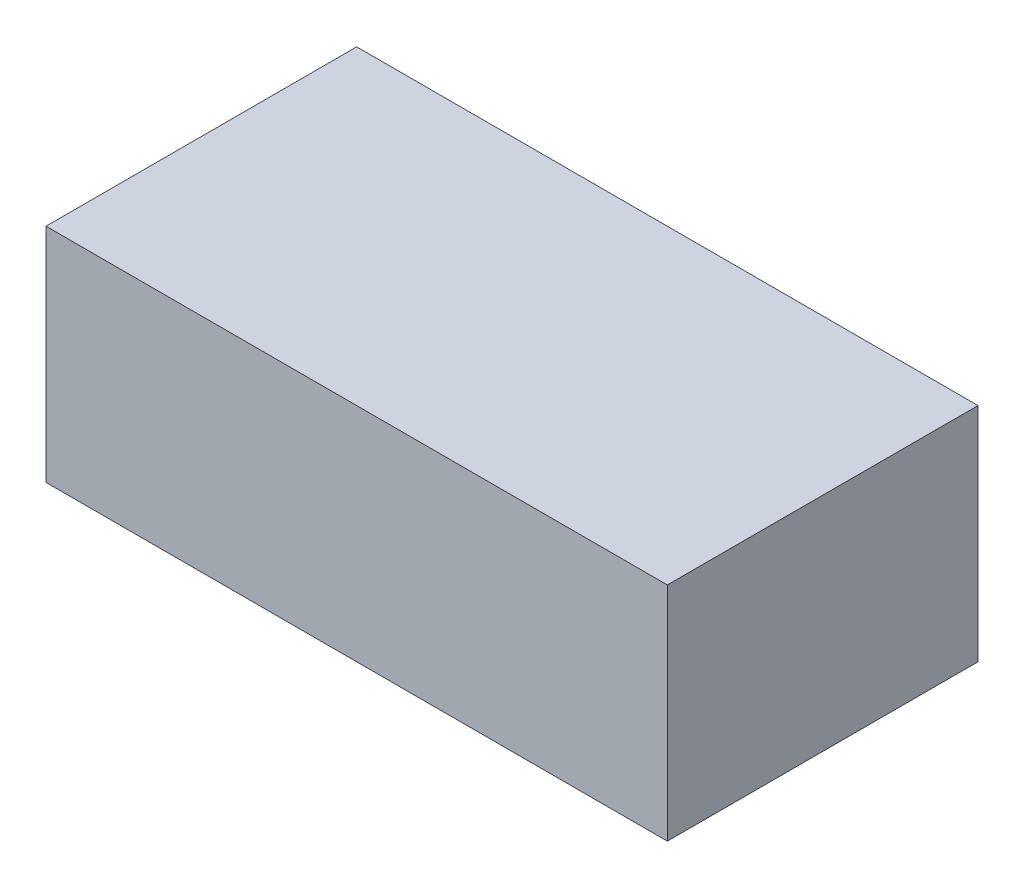
ISO-10303-21;
HEADER;
FILE_DESCRIPTION(('STEP AP214'),'2;1');
FILE_NAME('part.step','',(''),(''),'','','');
FILE_SCHEMA(('AUTOMOTIVE_DESIGN { 1 0 10303 214 1 1 1 1 }'));
ENDSEC;
DATA;
#1=APPLICATION_CONTEXT('core data for automotive mechanical design processes');
#2=APPLICATION_PROTOCOL_DEFINITION('international standard','automotive_design',2000,#1);
#3=PRODUCT_CONTEXT('',#1,'mechanical');
#4=PRODUCT('Part','Part','',(#3));
#5=PRODUCT_RELATED_PRODUCT_CATEGORY('part','',(#4));
#6=PRODUCT_DEFINITION_FORMATION('','',#4);
#7=PRODUCT_DEFINITION_CONTEXT('part definition',#1,'design');
#8=PRODUCT_DEFINITION('design','',#6,#7);
#9=PRODUCT_DEFINITION_SHAPE('','',#8);
#10=(LENGTH_UNIT() NAMED_UNIT(*) SI_UNIT(.MILLI.,.METRE.));
#11=(NAMED_UNIT(*) PLANE_ANGLE_UNIT() SI_UNIT($,.RADIAN.));
#12=(NAMED_UNIT(*) SI_UNIT($,.STERADIAN.) SOLID_ANGLE_UNIT());
#13=UNCERTAINTY_MEASURE_WITH_UNIT(LENGTH_MEASURE(1.E-05),#10,'distance_accuracy_value','');
#14=(GEOMETRIC_REPRESENTATION_CONTEXT(3) GLOBAL_UNCERTAINTY_ASSIGNED_CONTEXT((#13)) GLOBAL_UNIT_ASSIGNED_CONTEXT((#10,
#11,#12)) REPRESENTATION_CONTEXT('',''));
#15=CARTESIAN_POINT('',(0.,0.,0.));
#16=DIRECTION('',(0.,0.,1.));
#17=DIRECTION('',(1.,0.,0.));
#18=AXIS2_PLACEMENT_3D('',#15,#16,#17);
#19=CARTESIAN_POINT('',(0.,0.,0.));
#20=DIRECTION('',(0.,-1.,0.));
#21=DIRECTION('',(0.,0.,-1.));
#22=AXIS2_PLACEMENT_3D('',#19,#20,#21);
#23=PLANE('',#22);
#24=DIRECTION('',(0.,0.,-1.));
#25=VECTOR('',#24,1.);
#26=CARTESIAN_POINT('',(70.,0.,35.));
#27=LINE('',#26,#25);
#28=CARTESIAN_POINT('',(70.,0.,35.));
#29=VERTEX_POINT('',#28);
#30=CARTESIAN_POINT('',(70.,0.,-35.));
#31=VERTEX_POINT('',#30);
#32=EDGE_CURVE('E130',#29,#31,#27,.T.);
#33=ORIENTED_EDGE('',*,*,#32,.F.);
#34=DIRECTION('',(1.,0.,0.));
#35=VECTOR('',#34,1.);
#36=CARTESIAN_POINT('',(-70.,0.,35.));
#37=LINE('',#36,#35);
#38=CARTESIAN_POINT('',(-70.,0.,35.));
#39=VERTEX_POINT('',#38);
#40=EDGE_CURVE('E78',#39,#29,#37,.T.);
#41=ORIENTED_EDGE('',*,*,#40,.F.);
#42=DIRECTION('',(0.,0.,1.));
#43=VECTOR('',#42,1.);
#44=CARTESIAN_POINT('',(-70.,0.,35.));
#45=LINE('',#44,#43);
#46=CARTESIAN_POINT('',(-70.,0.,-35.));
#47=VERTEX_POINT('',#46);
#48=EDGE_CURVE('E158',#47,#39,#45,.T.);
#49=ORIENTED_EDGE('',*,*,#48,.F.);
#50=DIRECTION('',(-1.,0.,0.));
#51=VECTOR('',#50,1.);
#52=CARTESIAN_POINT('',(-70.,0.,-35.));
#53=LINE('',#52,#51);
#54=EDGE_CURVE('E134',#31,#47,#53,.T.);
#55=ORIENTED_EDGE('',*,*,#54,.F.);
#56=EDGE_LOOP('',(#33,#41,#49,#55));
#57=FACE_BOUND('',#56,.T.);
#58=DIRECTION('',(1.,0.,0.));
#59=VECTOR('',#58,1.);
#60=CARTESIAN_POINT('',(0.,0.,33.));
#61=LINE('',#60,#59);
#62=CARTESIAN_POINT('',(-68.,0.,33.));
#63=VERTEX_POINT('',#62);
#64=CARTESIAN_POINT('',(68.,0.,33.));
#65=VERTEX_POINT('',#64);
#66=EDGE_CURVE('E125',#63,#65,#61,.T.);
#67=ORIENTED_EDGE('',*,*,#66,.T.);
#68=DIRECTION('',(0.,0.,-1.));
#69=VECTOR('',#68,1.);
#70=CARTESIAN_POINT('',(68.,0.,0.));
#71=LINE('',#70,#69);
#72=CARTESIAN_POINT('',(68.,0.,-33.));
#73=VERTEX_POINT('',#72);
#74=EDGE_CURVE('E144',#65,#73,#71,.T.);
#75=ORIENTED_EDGE('',*,*,#74,.T.);
#76=DIRECTION('',(-1.,0.,0.));
#77=VECTOR('',#76,1.);
#78=CARTESIAN_POINT('',(0.,0.,-33.));
#79=LINE('',#78,#77);
#80=CARTESIAN_POINT('',(-68.,0.,-33.));
#81=VERTEX_POINT('',#80);
#82=EDGE_CURVE('E129',#73,#81,#79,.T.);
#83=ORIENTED_EDGE('',*,*,#82,.T.);
#84=DIRECTION('',(0.,0.,1.));
#85=VECTOR('',#84,1.);
#86=CARTESIAN_POINT('',(-68.,0.,0.));
#87=LINE('',#86,#85);
#88=EDGE_CURVE('E48',#81,#63,#87,.T.);
#89=ORIENTED_EDGE('',*,*,#88,.T.);
#90=EDGE_LOOP('',(#67,#75,#83,#89));
#91=FACE_BOUND('',#90,.T.);
#92=ADVANCED_FACE('F33',(#57,#91),#23,.T.);
#93=CARTESIAN_POINT('',(70.,50.,35.));
#94=DIRECTION('',(-1.,0.,0.));
#95=DIRECTION('',(0.,0.,1.));
#96=AXIS2_PLACEMENT_3D('',#93,#94,#95);
#97=PLANE('',#96);
#98=ORIENTED_EDGE('',*,*,#32,.T.);
#99=DIRECTION('',(0.,-1.,0.));
#100=VECTOR('',#99,1.);
#101=CARTESIAN_POINT('',(70.,50.,-35.));
#102=LINE('',#101,#100);
#103=CARTESIAN_POINT('',(70.,50.,-35.));
#104=VERTEX_POINT('',#103);
#105=EDGE_CURVE('E11',#104,#31,#102,.T.);
#106=ORIENTED_EDGE('',*,*,#105,.F.);
#107=DIRECTION('',(0.,0.,-1.));
#108=VECTOR('',#107,1.);
#109=CARTESIAN_POINT('',(70.,50.,35.));
#110=LINE('',#109,#108);
#111=CARTESIAN_POINT('',(70.,50.,35.));
#112=VERTEX_POINT('',#111);
#113=EDGE_CURVE('E150',#112,#104,#110,.T.);
#114=ORIENTED_EDGE('',*,*,#113,.F.);
#115=DIRECTION('',(0.,-1.,0.));
#116=VECTOR('',#115,1.);
#117=CARTESIAN_POINT('',(70.,50.,35.));
#118=LINE('',#117,#116);
#119=EDGE_CURVE('E155',#112,#29,#118,.T.);
#120=ORIENTED_EDGE('',*,*,#119,.T.);
#121=EDGE_LOOP('',(#98,#106,#114,#120));
#122=FACE_BOUND('',#121,.T.);
#123=ADVANCED_FACE('F35',(#122),#97,.F.);
#124=CARTESIAN_POINT('',(-70.,50.,-35.));
#125=DIRECTION('',(0.,0.,1.));
#126=DIRECTION('',(1.,0.,0.));
#127=AXIS2_PLACEMENT_3D('',#124,#125,#126);
#128=PLANE('',#127);
#129=ORIENTED_EDGE('',*,*,#54,.T.);
#130=DIRECTION('',(0.,-1.,0.));
#131=VECTOR('',#130,1.);
#132=CARTESIAN_POINT('',(-70.,50.,-35.));
#133=LINE('',#132,#131);
#134=CARTESIAN_POINT('',(-70.,50.,-35.));
#135=VERTEX_POINT('',#134);
#136=EDGE_CURVE('E41',#135,#47,#133,.T.);
#137=ORIENTED_EDGE('',*,*,#136,.F.);
#138=DIRECTION('',(-1.,0.,0.));
#139=VECTOR('',#138,1.);
#140=CARTESIAN_POINT('',(-70.,50.,-35.));
#141=LINE('',#140,#139);
#142=EDGE_CURVE('E85',#104,#135,#141,.T.);
#143=ORIENTED_EDGE('',*,*,#142,.F.);
#144=ORIENTED_EDGE('',*,*,#105,.T.);
#145=EDGE_LOOP('',(#129,#137,#143,#144));
#146=FACE_BOUND('',#145,.T.);
#147=ADVANCED_FACE('F184',(#146),#128,.F.);
#148=CARTESIAN_POINT('',(-70.,50.,35.));
#149=DIRECTION('',(1.,0.,0.));
#150=DIRECTION('',(0.,0.,-1.));
#151=AXIS2_PLACEMENT_3D('',#148,#149,#150);
#152=PLANE('',#151);
#153=ORIENTED_EDGE('',*,*,#48,.T.);
#154=DIRECTION('',(0.,-1.,0.));
#155=VECTOR('',#154,1.);
#156=CARTESIAN_POINT('',(-70.,50.,35.));
#157=LINE('',#156,#155);
#158=CARTESIAN_POINT('',(-70.,50.,35.));
#159=VERTEX_POINT('',#158);
#160=EDGE_CURVE('E162',#159,#39,#157,.T.);
#161=ORIENTED_EDGE('',*,*,#160,.F.);
#162=DIRECTION('',(0.,0.,1.));
#163=VECTOR('',#162,1.);
#164=CARTESIAN_POINT('',(-70.,50.,35.));
#165=LINE('',#164,#163);
#166=EDGE_CURVE('E153',#135,#159,#165,.T.);
#167=ORIENTED_EDGE('',*,*,#166,.F.);
#168=ORIENTED_EDGE('',*,*,#136,.T.);
#169=EDGE_LOOP('',(#153,#161,#167,#168));
#170=FACE_BOUND('',#169,.T.);
#171=ADVANCED_FACE('F167',(#170),#152,.F.);
#172=CARTESIAN_POINT('',(-70.,50.,35.));
#173=DIRECTION('',(0.,0.,-1.));
#174=DIRECTION('',(-1.,0.,0.));
#175=AXIS2_PLACEMENT_3D('',#172,#173,#174);
#176=PLANE('',#175);
#177=ORIENTED_EDGE('',*,*,#40,.T.);
#178=ORIENTED_EDGE('',*,*,#119,.F.);
#179=DIRECTION('',(1.,0.,0.));
#180=VECTOR('',#179,1.);
#181=CARTESIAN_POINT('',(-70.,50.,35.));
#182=LINE('',#181,#180);
#183=EDGE_CURVE('E57',#159,#112,#182,.T.);
#184=ORIENTED_EDGE('',*,*,#183,.F.);
#185=ORIENTED_EDGE('',*,*,#160,.T.);
#186=EDGE_LOOP('',(#177,#178,#184,#185));
#187=FACE_BOUND('',#186,.T.);
#188=ADVANCED_FACE('F175',(#187),#176,.F.);
#189=CARTESIAN_POINT('',(0.,50.,0.));
#190=DIRECTION('',(0.,-1.,0.));
#191=DIRECTION('',(0.,0.,-1.));
#192=AXIS2_PLACEMENT_3D('',#189,#190,#191);
#193=PLANE('',#192);
#194=ORIENTED_EDGE('',*,*,#113,.T.);
#195=ORIENTED_EDGE('',*,*,#142,.T.);
#196=ORIENTED_EDGE('',*,*,#166,.T.);
#197=ORIENTED_EDGE('',*,*,#183,.T.);
#198=EDGE_LOOP('',(#194,#195,#196,#197));
#199=FACE_BOUND('',#198,.T.);
#200=ADVANCED_FACE('F177',(#199),#193,.F.);
#201=CARTESIAN_POINT('',(68.,50.,35.));
#202=DIRECTION('',(-1.,0.,0.));
#203=DIRECTION('',(0.,0.,1.));
#204=AXIS2_PLACEMENT_3D('',#201,#202,#203);
#205=PLANE('',#204);
#206=ORIENTED_EDGE('',*,*,#74,.F.);
#207=DIRECTION('',(0.,-1.,0.));
#208=VECTOR('',#207,1.);
#209=CARTESIAN_POINT('',(68.,50.,33.));
#210=LINE('',#209,#208);
#211=CARTESIAN_POINT('',(68.,48.,33.));
#212=VERTEX_POINT('',#211);
#213=EDGE_CURVE('E124',#212,#65,#210,.T.);
#214=ORIENTED_EDGE('',*,*,#213,.F.);
#215=DIRECTION('',(0.,0.,-1.));
#216=VECTOR('',#215,1.);
#217=CARTESIAN_POINT('',(68.,48.,0.));
#218=LINE('',#217,#216);
#219=CARTESIAN_POINT('',(68.,48.,-33.));
#220=VERTEX_POINT('',#219);
#221=EDGE_CURVE('E112',#212,#220,#218,.T.);
#222=ORIENTED_EDGE('',*,*,#221,.T.);
#223=DIRECTION('',(0.,-1.,0.));
#224=VECTOR('',#223,1.);
#225=CARTESIAN_POINT('',(68.,50.,-33.));
#226=LINE('',#225,#224);
#227=EDGE_CURVE('E122',#220,#73,#226,.T.);
#228=ORIENTED_EDGE('',*,*,#227,.T.);
#229=EDGE_LOOP('',(#206,#214,#222,#228));
#230=FACE_BOUND('',#229,.T.);
#231=ADVANCED_FACE('F121',(#230),#205,.T.);
#232=CARTESIAN_POINT('',(-70.,50.,-33.));
#233=DIRECTION('',(0.,0.,1.));
#234=DIRECTION('',(1.,0.,0.));
#235=AXIS2_PLACEMENT_3D('',#232,#233,#234);
#236=PLANE('',#235);
#237=ORIENTED_EDGE('',*,*,#82,.F.);
#238=ORIENTED_EDGE('',*,*,#227,.F.);
#239=DIRECTION('',(-1.,0.,0.));
#240=VECTOR('',#239,1.);
#241=CARTESIAN_POINT('',(0.,48.,-33.));
#242=LINE('',#241,#240);
#243=CARTESIAN_POINT('',(-68.,48.,-33.));
#244=VERTEX_POINT('',#243);
#245=EDGE_CURVE('E108',#220,#244,#242,.T.);
#246=ORIENTED_EDGE('',*,*,#245,.T.);
#247=DIRECTION('',(0.,-1.,0.));
#248=VECTOR('',#247,1.);
#249=CARTESIAN_POINT('',(-68.,50.,-33.));
#250=LINE('',#249,#248);
#251=EDGE_CURVE('E131',#244,#81,#250,.T.);
#252=ORIENTED_EDGE('',*,*,#251,.T.);
#253=EDGE_LOOP('',(#237,#238,#246,#252));
#254=FACE_BOUND('',#253,.T.);
#255=ADVANCED_FACE('F127',(#254),#236,.T.);
#256=CARTESIAN_POINT('',(-68.,50.,35.));
#257=DIRECTION('',(1.,0.,0.));
#258=DIRECTION('',(0.,0.,-1.));
#259=AXIS2_PLACEMENT_3D('',#256,#257,#258);
#260=PLANE('',#259);
#261=ORIENTED_EDGE('',*,*,#88,.F.);
#262=ORIENTED_EDGE('',*,*,#251,.F.);
#263=DIRECTION('',(0.,0.,1.));
#264=VECTOR('',#263,1.);
#265=CARTESIAN_POINT('',(-68.,48.,0.));
#266=LINE('',#265,#264);
#267=CARTESIAN_POINT('',(-68.,48.,33.));
#268=VERTEX_POINT('',#267);
#269=EDGE_CURVE('E113',#244,#268,#266,.T.);
#270=ORIENTED_EDGE('',*,*,#269,.T.);
#271=DIRECTION('',(0.,-1.,0.));
#272=VECTOR('',#271,1.);
#273=CARTESIAN_POINT('',(-68.,50.,33.));
#274=LINE('',#273,#272);
#275=EDGE_CURVE('E136',#268,#63,#274,.T.);
#276=ORIENTED_EDGE('',*,*,#275,.T.);
#277=EDGE_LOOP('',(#261,#262,#270,#276));
#278=FACE_BOUND('',#277,.T.);
#279=ADVANCED_FACE('F197',(#278),#260,.T.);
#280=CARTESIAN_POINT('',(-70.,50.,33.));
#281=DIRECTION('',(0.,0.,-1.));
#282=DIRECTION('',(-1.,0.,0.));
#283=AXIS2_PLACEMENT_3D('',#280,#281,#282);
#284=PLANE('',#283);
#285=ORIENTED_EDGE('',*,*,#66,.F.);
#286=ORIENTED_EDGE('',*,*,#275,.F.);
#287=DIRECTION('',(1.,0.,0.));
#288=VECTOR('',#287,1.);
#289=CARTESIAN_POINT('',(0.,48.,33.));
#290=LINE('',#289,#288);
#291=EDGE_CURVE('E139',#268,#212,#290,.T.);
#292=ORIENTED_EDGE('',*,*,#291,.T.);
#293=ORIENTED_EDGE('',*,*,#213,.T.);
#294=EDGE_LOOP('',(#285,#286,#292,#293));
#295=FACE_BOUND('',#294,.T.);
#296=ADVANCED_FACE('F194',(#295),#284,.T.);
#297=CARTESIAN_POINT('',(0.,48.,0.));
#298=DIRECTION('',(0.,-1.,0.));
#299=DIRECTION('',(0.,0.,-1.));
#300=AXIS2_PLACEMENT_3D('',#297,#298,#299);
#301=PLANE('',#300);
#302=ORIENTED_EDGE('',*,*,#221,.F.);
#303=ORIENTED_EDGE('',*,*,#291,.F.);
#304=ORIENTED_EDGE('',*,*,#269,.F.);
#305=ORIENTED_EDGE('',*,*,#245,.F.);
#306=EDGE_LOOP('',(#302,#303,#304,#305));
#307=FACE_BOUND('',#306,.T.);
#308=ADVANCED_FACE('F110',(#307),#301,.T.);
#309=CLOSED_SHELL('',(#92,#123,#147,#171,#188,#200,#231,#255,#279,#296,#308));
#310=MANIFOLD_SOLID_BREP('B2',#309);
#311=ADVANCED_BREP_SHAPE_REPRESENTATION('',(#18,#310),#14);
#312=SHAPE_DEFINITION_REPRESENTATION(#9,#311);
ENDSEC;
END-ISO-10303-21;
